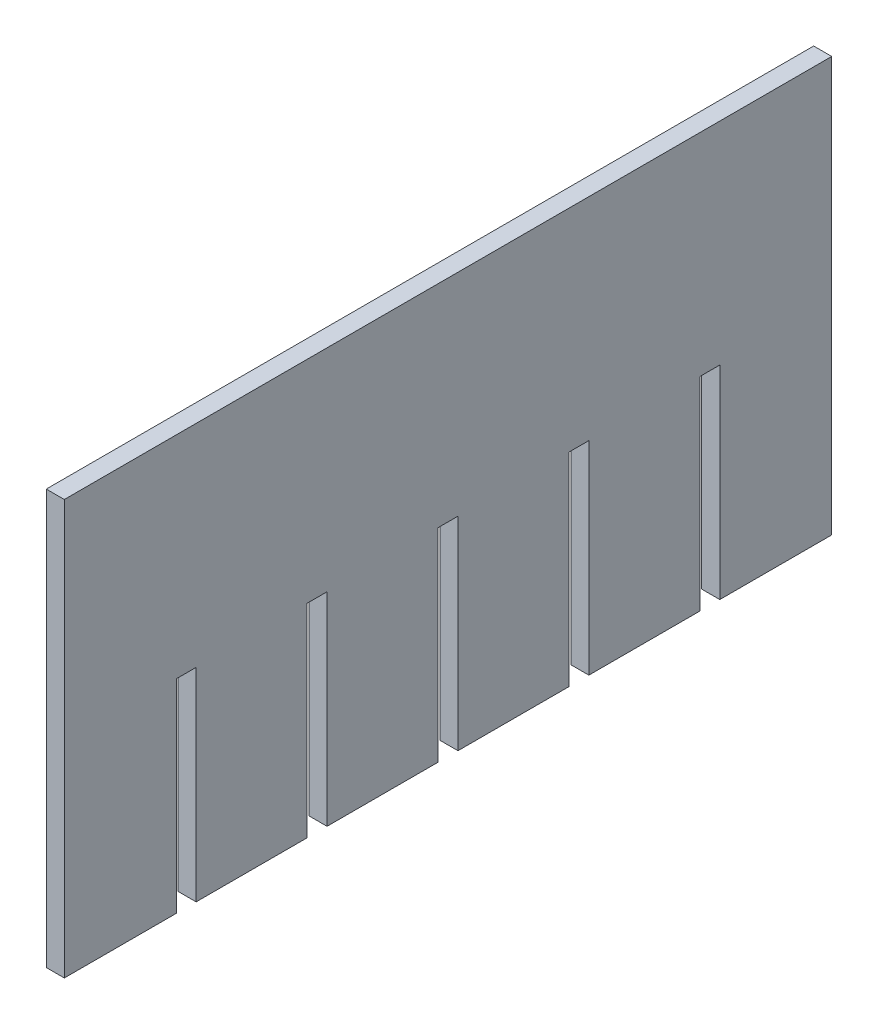
ISO-10303-21;
HEADER;
FILE_DESCRIPTION(('STEP AP214'),'2;1');
FILE_NAME('part.step','',(''),(''),'','','');
FILE_SCHEMA(('AUTOMOTIVE_DESIGN { 1 0 10303 214 1 1 1 1 }'));
ENDSEC;
DATA;
#1=APPLICATION_CONTEXT('core data for automotive mechanical design processes');
#2=APPLICATION_PROTOCOL_DEFINITION('international standard','automotive_design',2000,#1);
#3=PRODUCT_CONTEXT('',#1,'mechanical');
#4=PRODUCT('Part','Part','',(#3));
#5=PRODUCT_RELATED_PRODUCT_CATEGORY('part','',(#4));
#6=PRODUCT_DEFINITION_FORMATION('','',#4);
#7=PRODUCT_DEFINITION_CONTEXT('part definition',#1,'design');
#8=PRODUCT_DEFINITION('design','',#6,#7);
#9=PRODUCT_DEFINITION_SHAPE('','',#8);
#10=(LENGTH_UNIT() NAMED_UNIT(*) SI_UNIT(.MILLI.,.METRE.));
#11=(NAMED_UNIT(*) PLANE_ANGLE_UNIT() SI_UNIT($,.RADIAN.));
#12=(NAMED_UNIT(*) SI_UNIT($,.STERADIAN.) SOLID_ANGLE_UNIT());
#13=UNCERTAINTY_MEASURE_WITH_UNIT(LENGTH_MEASURE(1.E-05),#10,'distance_accuracy_value','');
#14=(GEOMETRIC_REPRESENTATION_CONTEXT(3) GLOBAL_UNCERTAINTY_ASSIGNED_CONTEXT((#13)) GLOBAL_UNIT_ASSIGNED_CONTEXT((#10,
#11,#12)) REPRESENTATION_CONTEXT('',''));
#15=CARTESIAN_POINT('',(0.,0.,0.));
#16=DIRECTION('',(0.,0.,1.));
#17=DIRECTION('',(1.,0.,0.));
#18=AXIS2_PLACEMENT_3D('',#15,#16,#17);
#19=CARTESIAN_POINT('',(4.,0.,0.));
#20=DIRECTION('',(0.,1.,0.));
#21=DIRECTION('',(0.,0.,1.));
#22=AXIS2_PLACEMENT_3D('',#19,#20,#21);
#23=PLANE('',#22);
#24=DIRECTION('',(0.,0.,-1.));
#25=VECTOR('',#24,1.);
#26=CARTESIAN_POINT('',(0.,0.,0.));
#27=LINE('',#26,#25);
#28=CARTESIAN_POINT('',(0.,0.,0.));
#29=VERTEX_POINT('',#28);
#30=CARTESIAN_POINT('',(0.,0.,-24.8));
#31=VERTEX_POINT('',#30);
#32=EDGE_CURVE('E229',#29,#31,#27,.T.);
#33=ORIENTED_EDGE('',*,*,#32,.T.);
#34=DIRECTION('',(-1.,0.,0.));
#35=VECTOR('',#34,1.);
#36=CARTESIAN_POINT('',(4.,0.,-24.8));
#37=LINE('',#36,#35);
#38=CARTESIAN_POINT('',(4.,0.,-24.8));
#39=VERTEX_POINT('',#38);
#40=EDGE_CURVE('E11',#39,#31,#37,.T.);
#41=ORIENTED_EDGE('',*,*,#40,.F.);
#42=DIRECTION('',(0.,0.,-1.));
#43=VECTOR('',#42,1.);
#44=CARTESIAN_POINT('',(4.,0.,0.));
#45=LINE('',#44,#43);
#46=CARTESIAN_POINT('',(4.,0.,0.));
#47=VERTEX_POINT('',#46);
#48=EDGE_CURVE('E275',#47,#39,#45,.T.);
#49=ORIENTED_EDGE('',*,*,#48,.F.);
#50=DIRECTION('',(-1.,0.,0.));
#51=VECTOR('',#50,1.);
#52=CARTESIAN_POINT('',(4.,0.,0.));
#53=LINE('',#52,#51);
#54=EDGE_CURVE('E225',#47,#29,#53,.T.);
#55=ORIENTED_EDGE('',*,*,#54,.T.);
#56=EDGE_LOOP('',(#33,#41,#49,#55));
#57=FACE_BOUND('',#56,.T.);
#58=ADVANCED_FACE('F37',(#57),#23,.F.);
#59=CARTESIAN_POINT('',(4.,0.,-24.8));
#60=DIRECTION('',(0.,0.,1.));
#61=DIRECTION('',(1.,0.,0.));
#62=AXIS2_PLACEMENT_3D('',#59,#60,#61);
#63=PLANE('',#62);
#64=DIRECTION('',(0.,1.,0.));
#65=VECTOR('',#64,1.);
#66=CARTESIAN_POINT('',(0.,0.,-24.8));
#67=LINE('',#66,#65);
#68=CARTESIAN_POINT('',(0.,45.,-24.8));
#69=VERTEX_POINT('',#68);
#70=EDGE_CURVE('E232',#31,#69,#67,.T.);
#71=ORIENTED_EDGE('',*,*,#70,.T.);
#72=DIRECTION('',(-1.,0.,0.));
#73=VECTOR('',#72,1.);
#74=CARTESIAN_POINT('',(4.,45.,-24.8));
#75=LINE('',#74,#73);
#76=CARTESIAN_POINT('',(4.,45.,-24.8));
#77=VERTEX_POINT('',#76);
#78=EDGE_CURVE('E45',#77,#69,#75,.T.);
#79=ORIENTED_EDGE('',*,*,#78,.F.);
#80=DIRECTION('',(0.,1.,0.));
#81=VECTOR('',#80,1.);
#82=CARTESIAN_POINT('',(4.,0.,-24.8));
#83=LINE('',#82,#81);
#84=EDGE_CURVE('E144',#39,#77,#83,.T.);
#85=ORIENTED_EDGE('',*,*,#84,.F.);
#86=ORIENTED_EDGE('',*,*,#40,.T.);
#87=EDGE_LOOP('',(#71,#79,#85,#86));
#88=FACE_BOUND('',#87,.T.);
#89=ADVANCED_FACE('F413',(#88),#63,.F.);
#90=CARTESIAN_POINT('',(4.,45.,-24.8));
#91=DIRECTION('',(0.,1.,0.));
#92=DIRECTION('',(0.,0.,1.));
#93=AXIS2_PLACEMENT_3D('',#90,#91,#92);
#94=PLANE('',#93);
#95=DIRECTION('',(0.,0.,-1.));
#96=VECTOR('',#95,1.);
#97=CARTESIAN_POINT('',(0.,45.,-24.8));
#98=LINE('',#97,#96);
#99=CARTESIAN_POINT('',(0.,45.,-29.2));
#100=VERTEX_POINT('',#99);
#101=EDGE_CURVE('E234',#69,#100,#98,.T.);
#102=ORIENTED_EDGE('',*,*,#101,.T.);
#103=DIRECTION('',(-1.,0.,0.));
#104=VECTOR('',#103,1.);
#105=CARTESIAN_POINT('',(4.,45.,-29.2));
#106=LINE('',#105,#104);
#107=CARTESIAN_POINT('',(4.,45.,-29.2));
#108=VERTEX_POINT('',#107);
#109=EDGE_CURVE('E330',#108,#100,#106,.T.);
#110=ORIENTED_EDGE('',*,*,#109,.F.);
#111=DIRECTION('',(0.,0.,-1.));
#112=VECTOR('',#111,1.);
#113=CARTESIAN_POINT('',(4.,45.,-24.8));
#114=LINE('',#113,#112);
#115=EDGE_CURVE('E338',#77,#108,#114,.T.);
#116=ORIENTED_EDGE('',*,*,#115,.F.);
#117=ORIENTED_EDGE('',*,*,#78,.T.);
#118=EDGE_LOOP('',(#102,#110,#116,#117));
#119=FACE_BOUND('',#118,.T.);
#120=ADVANCED_FACE('F336',(#119),#94,.F.);
#121=CARTESIAN_POINT('',(4.,45.,-29.2));
#122=DIRECTION('',(0.,0.,-1.));
#123=DIRECTION('',(0.,1.,0.));
#124=AXIS2_PLACEMENT_3D('',#121,#122,#123);
#125=PLANE('',#124);
#126=DIRECTION('',(0.,-1.,0.));
#127=VECTOR('',#126,1.);
#128=CARTESIAN_POINT('',(0.,45.,-29.2));
#129=LINE('',#128,#127);
#130=CARTESIAN_POINT('',(0.,0.,-29.2));
#131=VERTEX_POINT('',#130);
#132=EDGE_CURVE('E236',#100,#131,#129,.T.);
#133=ORIENTED_EDGE('',*,*,#132,.T.);
#134=DIRECTION('',(-1.,0.,0.));
#135=VECTOR('',#134,1.);
#136=CARTESIAN_POINT('',(4.,0.,-29.2));
#137=LINE('',#136,#135);
#138=CARTESIAN_POINT('',(4.,0.,-29.2));
#139=VERTEX_POINT('',#138);
#140=EDGE_CURVE('E327',#139,#131,#137,.T.);
#141=ORIENTED_EDGE('',*,*,#140,.F.);
#142=DIRECTION('',(0.,-1.,0.));
#143=VECTOR('',#142,1.);
#144=CARTESIAN_POINT('',(4.,45.,-29.2));
#145=LINE('',#144,#143);
#146=EDGE_CURVE('E356',#108,#139,#145,.T.);
#147=ORIENTED_EDGE('',*,*,#146,.F.);
#148=ORIENTED_EDGE('',*,*,#109,.T.);
#149=EDGE_LOOP('',(#133,#141,#147,#148));
#150=FACE_BOUND('',#149,.T.);
#151=ADVANCED_FACE('F347',(#150),#125,.F.);
#152=CARTESIAN_POINT('',(4.,0.,-29.2));
#153=DIRECTION('',(0.,1.,0.));
#154=DIRECTION('',(0.,0.,1.));
#155=AXIS2_PLACEMENT_3D('',#152,#153,#154);
#156=PLANE('',#155);
#157=DIRECTION('',(0.,0.,-1.));
#158=VECTOR('',#157,1.);
#159=CARTESIAN_POINT('',(0.,0.,-29.2));
#160=LINE('',#159,#158);
#161=CARTESIAN_POINT('',(0.,0.,-53.8));
#162=VERTEX_POINT('',#161);
#163=EDGE_CURVE('E238',#131,#162,#160,.T.);
#164=ORIENTED_EDGE('',*,*,#163,.T.);
#165=DIRECTION('',(-1.,0.,0.));
#166=VECTOR('',#165,1.);
#167=CARTESIAN_POINT('',(4.,0.,-53.8));
#168=LINE('',#167,#166);
#169=CARTESIAN_POINT('',(4.,0.,-53.8));
#170=VERTEX_POINT('',#169);
#171=EDGE_CURVE('E324',#170,#162,#168,.T.);
#172=ORIENTED_EDGE('',*,*,#171,.F.);
#173=DIRECTION('',(0.,0.,-1.));
#174=VECTOR('',#173,1.);
#175=CARTESIAN_POINT('',(4.,0.,-29.2));
#176=LINE('',#175,#174);
#177=EDGE_CURVE('E353',#139,#170,#176,.T.);
#178=ORIENTED_EDGE('',*,*,#177,.F.);
#179=ORIENTED_EDGE('',*,*,#140,.T.);
#180=EDGE_LOOP('',(#164,#172,#178,#179));
#181=FACE_BOUND('',#180,.T.);
#182=ADVANCED_FACE('F351',(#181),#156,.F.);
#183=CARTESIAN_POINT('',(4.,0.,-53.8));
#184=DIRECTION('',(0.,0.,1.));
#185=DIRECTION('',(1.,0.,0.));
#186=AXIS2_PLACEMENT_3D('',#183,#184,#185);
#187=PLANE('',#186);
#188=DIRECTION('',(0.,1.,0.));
#189=VECTOR('',#188,1.);
#190=CARTESIAN_POINT('',(0.,0.,-53.8));
#191=LINE('',#190,#189);
#192=CARTESIAN_POINT('',(0.,45.,-53.8));
#193=VERTEX_POINT('',#192);
#194=EDGE_CURVE('E240',#162,#193,#191,.T.);
#195=ORIENTED_EDGE('',*,*,#194,.T.);
#196=DIRECTION('',(-1.,0.,0.));
#197=VECTOR('',#196,1.);
#198=CARTESIAN_POINT('',(4.,45.,-53.8));
#199=LINE('',#198,#197);
#200=CARTESIAN_POINT('',(4.,45.,-53.8));
#201=VERTEX_POINT('',#200);
#202=EDGE_CURVE('E321',#201,#193,#199,.T.);
#203=ORIENTED_EDGE('',*,*,#202,.F.);
#204=DIRECTION('',(0.,1.,0.));
#205=VECTOR('',#204,1.);
#206=CARTESIAN_POINT('',(4.,0.,-53.8));
#207=LINE('',#206,#205);
#208=EDGE_CURVE('E355',#170,#201,#207,.T.);
#209=ORIENTED_EDGE('',*,*,#208,.F.);
#210=ORIENTED_EDGE('',*,*,#171,.T.);
#211=EDGE_LOOP('',(#195,#203,#209,#210));
#212=FACE_BOUND('',#211,.T.);
#213=ADVANCED_FACE('F426',(#212),#187,.F.);
#214=CARTESIAN_POINT('',(4.,45.,-53.8));
#215=DIRECTION('',(0.,1.,0.));
#216=DIRECTION('',(0.,0.,1.));
#217=AXIS2_PLACEMENT_3D('',#214,#215,#216);
#218=PLANE('',#217);
#219=DIRECTION('',(0.,0.,-1.));
#220=VECTOR('',#219,1.);
#221=CARTESIAN_POINT('',(0.,45.,-53.8));
#222=LINE('',#221,#220);
#223=CARTESIAN_POINT('',(0.,45.,-58.2));
#224=VERTEX_POINT('',#223);
#225=EDGE_CURVE('E242',#193,#224,#222,.T.);
#226=ORIENTED_EDGE('',*,*,#225,.T.);
#227=DIRECTION('',(-1.,0.,0.));
#228=VECTOR('',#227,1.);
#229=CARTESIAN_POINT('',(4.,45.,-58.2));
#230=LINE('',#229,#228);
#231=CARTESIAN_POINT('',(4.,45.,-58.2));
#232=VERTEX_POINT('',#231);
#233=EDGE_CURVE('E318',#232,#224,#230,.T.);
#234=ORIENTED_EDGE('',*,*,#233,.F.);
#235=DIRECTION('',(0.,0.,-1.));
#236=VECTOR('',#235,1.);
#237=CARTESIAN_POINT('',(4.,45.,-53.8));
#238=LINE('',#237,#236);
#239=EDGE_CURVE('E358',#201,#232,#238,.T.);
#240=ORIENTED_EDGE('',*,*,#239,.F.);
#241=ORIENTED_EDGE('',*,*,#202,.T.);
#242=EDGE_LOOP('',(#226,#234,#240,#241));
#243=FACE_BOUND('',#242,.T.);
#244=ADVANCED_FACE('F429',(#243),#218,.F.);
#245=CARTESIAN_POINT('',(4.,45.,-58.2));
#246=DIRECTION('',(0.,0.,-1.));
#247=DIRECTION('',(0.,1.,0.));
#248=AXIS2_PLACEMENT_3D('',#245,#246,#247);
#249=PLANE('',#248);
#250=DIRECTION('',(0.,-1.,0.));
#251=VECTOR('',#250,1.);
#252=CARTESIAN_POINT('',(0.,45.,-58.2));
#253=LINE('',#252,#251);
#254=CARTESIAN_POINT('',(0.,0.,-58.2));
#255=VERTEX_POINT('',#254);
#256=EDGE_CURVE('E244',#224,#255,#253,.T.);
#257=ORIENTED_EDGE('',*,*,#256,.T.);
#258=DIRECTION('',(-1.,0.,0.));
#259=VECTOR('',#258,1.);
#260=CARTESIAN_POINT('',(4.,0.,-58.2));
#261=LINE('',#260,#259);
#262=CARTESIAN_POINT('',(4.,0.,-58.2));
#263=VERTEX_POINT('',#262);
#264=EDGE_CURVE('E315',#263,#255,#261,.T.);
#265=ORIENTED_EDGE('',*,*,#264,.F.);
#266=DIRECTION('',(0.,-1.,0.));
#267=VECTOR('',#266,1.);
#268=CARTESIAN_POINT('',(4.,45.,-58.2));
#269=LINE('',#268,#267);
#270=EDGE_CURVE('E364',#232,#263,#269,.T.);
#271=ORIENTED_EDGE('',*,*,#270,.F.);
#272=ORIENTED_EDGE('',*,*,#233,.T.);
#273=EDGE_LOOP('',(#257,#265,#271,#272));
#274=FACE_BOUND('',#273,.T.);
#275=ADVANCED_FACE('F433',(#274),#249,.F.);
#276=CARTESIAN_POINT('',(4.,0.,-58.2));
#277=DIRECTION('',(0.,1.,0.));
#278=DIRECTION('',(0.,0.,1.));
#279=AXIS2_PLACEMENT_3D('',#276,#277,#278);
#280=PLANE('',#279);
#281=DIRECTION('',(0.,0.,-1.));
#282=VECTOR('',#281,1.);
#283=CARTESIAN_POINT('',(0.,0.,-58.2));
#284=LINE('',#283,#282);
#285=CARTESIAN_POINT('',(0.,0.,-82.8));
#286=VERTEX_POINT('',#285);
#287=EDGE_CURVE('E246',#255,#286,#284,.T.);
#288=ORIENTED_EDGE('',*,*,#287,.T.);
#289=DIRECTION('',(-1.,0.,0.));
#290=VECTOR('',#289,1.);
#291=CARTESIAN_POINT('',(4.,0.,-82.8));
#292=LINE('',#291,#290);
#293=CARTESIAN_POINT('',(4.,0.,-82.8));
#294=VERTEX_POINT('',#293);
#295=EDGE_CURVE('E312',#294,#286,#292,.T.);
#296=ORIENTED_EDGE('',*,*,#295,.F.);
#297=DIRECTION('',(0.,0.,-1.));
#298=VECTOR('',#297,1.);
#299=CARTESIAN_POINT('',(4.,0.,-58.2));
#300=LINE('',#299,#298);
#301=EDGE_CURVE('E366',#263,#294,#300,.T.);
#302=ORIENTED_EDGE('',*,*,#301,.F.);
#303=ORIENTED_EDGE('',*,*,#264,.T.);
#304=EDGE_LOOP('',(#288,#296,#302,#303));
#305=FACE_BOUND('',#304,.T.);
#306=ADVANCED_FACE('F437',(#305),#280,.F.);
#307=CARTESIAN_POINT('',(4.,0.,-82.8));
#308=DIRECTION('',(0.,0.,1.));
#309=DIRECTION('',(1.,0.,0.));
#310=AXIS2_PLACEMENT_3D('',#307,#308,#309);
#311=PLANE('',#310);
#312=DIRECTION('',(0.,1.,0.));
#313=VECTOR('',#312,1.);
#314=CARTESIAN_POINT('',(0.,0.,-82.8));
#315=LINE('',#314,#313);
#316=CARTESIAN_POINT('',(0.,45.,-82.8));
#317=VERTEX_POINT('',#316);
#318=EDGE_CURVE('E248',#286,#317,#315,.T.);
#319=ORIENTED_EDGE('',*,*,#318,.T.);
#320=DIRECTION('',(-1.,0.,0.));
#321=VECTOR('',#320,1.);
#322=CARTESIAN_POINT('',(4.,45.,-82.8));
#323=LINE('',#322,#321);
#324=CARTESIAN_POINT('',(4.,45.,-82.8));
#325=VERTEX_POINT('',#324);
#326=EDGE_CURVE('E309',#325,#317,#323,.T.);
#327=ORIENTED_EDGE('',*,*,#326,.F.);
#328=DIRECTION('',(0.,1.,0.));
#329=VECTOR('',#328,1.);
#330=CARTESIAN_POINT('',(4.,0.,-82.8));
#331=LINE('',#330,#329);
#332=EDGE_CURVE('E368',#294,#325,#331,.T.);
#333=ORIENTED_EDGE('',*,*,#332,.F.);
#334=ORIENTED_EDGE('',*,*,#295,.T.);
#335=EDGE_LOOP('',(#319,#327,#333,#334));
#336=FACE_BOUND('',#335,.T.);
#337=ADVANCED_FACE('F441',(#336),#311,.F.);
#338=CARTESIAN_POINT('',(4.,45.,-82.8));
#339=DIRECTION('',(0.,1.,0.));
#340=DIRECTION('',(0.,0.,1.));
#341=AXIS2_PLACEMENT_3D('',#338,#339,#340);
#342=PLANE('',#341);
#343=DIRECTION('',(0.,0.,-1.));
#344=VECTOR('',#343,1.);
#345=CARTESIAN_POINT('',(0.,45.,-82.8));
#346=LINE('',#345,#344);
#347=CARTESIAN_POINT('',(0.,45.,-87.2));
#348=VERTEX_POINT('',#347);
#349=EDGE_CURVE('E250',#317,#348,#346,.T.);
#350=ORIENTED_EDGE('',*,*,#349,.T.);
#351=DIRECTION('',(-1.,0.,0.));
#352=VECTOR('',#351,1.);
#353=CARTESIAN_POINT('',(4.,45.,-87.2));
#354=LINE('',#353,#352);
#355=CARTESIAN_POINT('',(4.,45.,-87.2));
#356=VERTEX_POINT('',#355);
#357=EDGE_CURVE('E306',#356,#348,#354,.T.);
#358=ORIENTED_EDGE('',*,*,#357,.F.);
#359=DIRECTION('',(0.,0.,-1.));
#360=VECTOR('',#359,1.);
#361=CARTESIAN_POINT('',(4.,45.,-82.8));
#362=LINE('',#361,#360);
#363=EDGE_CURVE('E370',#325,#356,#362,.T.);
#364=ORIENTED_EDGE('',*,*,#363,.F.);
#365=ORIENTED_EDGE('',*,*,#326,.T.);
#366=EDGE_LOOP('',(#350,#358,#364,#365));
#367=FACE_BOUND('',#366,.T.);
#368=ADVANCED_FACE('F445',(#367),#342,.F.);
#369=CARTESIAN_POINT('',(4.,45.,-87.2));
#370=DIRECTION('',(0.,0.,-1.));
#371=DIRECTION('',(0.,1.,0.));
#372=AXIS2_PLACEMENT_3D('',#369,#370,#371);
#373=PLANE('',#372);
#374=DIRECTION('',(0.,-1.,0.));
#375=VECTOR('',#374,1.);
#376=CARTESIAN_POINT('',(0.,45.,-87.2));
#377=LINE('',#376,#375);
#378=CARTESIAN_POINT('',(0.,0.,-87.2));
#379=VERTEX_POINT('',#378);
#380=EDGE_CURVE('E252',#348,#379,#377,.T.);
#381=ORIENTED_EDGE('',*,*,#380,.T.);
#382=DIRECTION('',(-1.,0.,0.));
#383=VECTOR('',#382,1.);
#384=CARTESIAN_POINT('',(4.,0.,-87.2));
#385=LINE('',#384,#383);
#386=CARTESIAN_POINT('',(4.,0.,-87.2));
#387=VERTEX_POINT('',#386);
#388=EDGE_CURVE('E303',#387,#379,#385,.T.);
#389=ORIENTED_EDGE('',*,*,#388,.F.);
#390=DIRECTION('',(0.,-1.,0.));
#391=VECTOR('',#390,1.);
#392=CARTESIAN_POINT('',(4.,45.,-87.2));
#393=LINE('',#392,#391);
#394=EDGE_CURVE('E372',#356,#387,#393,.T.);
#395=ORIENTED_EDGE('',*,*,#394,.F.);
#396=ORIENTED_EDGE('',*,*,#357,.T.);
#397=EDGE_LOOP('',(#381,#389,#395,#396));
#398=FACE_BOUND('',#397,.T.);
#399=ADVANCED_FACE('F449',(#398),#373,.F.);
#400=CARTESIAN_POINT('',(4.,0.,-87.2));
#401=DIRECTION('',(0.,1.,0.));
#402=DIRECTION('',(0.,0.,1.));
#403=AXIS2_PLACEMENT_3D('',#400,#401,#402);
#404=PLANE('',#403);
#405=DIRECTION('',(0.,0.,-1.));
#406=VECTOR('',#405,1.);
#407=CARTESIAN_POINT('',(0.,0.,-87.2));
#408=LINE('',#407,#406);
#409=CARTESIAN_POINT('',(0.,0.,-111.8));
#410=VERTEX_POINT('',#409);
#411=EDGE_CURVE('E254',#379,#410,#408,.T.);
#412=ORIENTED_EDGE('',*,*,#411,.T.);
#413=DIRECTION('',(-1.,0.,0.));
#414=VECTOR('',#413,1.);
#415=CARTESIAN_POINT('',(4.,0.,-111.8));
#416=LINE('',#415,#414);
#417=CARTESIAN_POINT('',(4.,0.,-111.8));
#418=VERTEX_POINT('',#417);
#419=EDGE_CURVE('E300',#418,#410,#416,.T.);
#420=ORIENTED_EDGE('',*,*,#419,.F.);
#421=DIRECTION('',(0.,0.,-1.));
#422=VECTOR('',#421,1.);
#423=CARTESIAN_POINT('',(4.,0.,-87.2));
#424=LINE('',#423,#422);
#425=EDGE_CURVE('E374',#387,#418,#424,.T.);
#426=ORIENTED_EDGE('',*,*,#425,.F.);
#427=ORIENTED_EDGE('',*,*,#388,.T.);
#428=EDGE_LOOP('',(#412,#420,#426,#427));
#429=FACE_BOUND('',#428,.T.);
#430=ADVANCED_FACE('F453',(#429),#404,.F.);
#431=CARTESIAN_POINT('',(4.,0.,-111.8));
#432=DIRECTION('',(0.,0.,1.));
#433=DIRECTION('',(1.,0.,0.));
#434=AXIS2_PLACEMENT_3D('',#431,#432,#433);
#435=PLANE('',#434);
#436=DIRECTION('',(0.,1.,0.));
#437=VECTOR('',#436,1.);
#438=CARTESIAN_POINT('',(0.,0.,-111.8));
#439=LINE('',#438,#437);
#440=CARTESIAN_POINT('',(0.,45.,-111.8));
#441=VERTEX_POINT('',#440);
#442=EDGE_CURVE('E256',#410,#441,#439,.T.);
#443=ORIENTED_EDGE('',*,*,#442,.T.);
#444=DIRECTION('',(-1.,0.,0.));
#445=VECTOR('',#444,1.);
#446=CARTESIAN_POINT('',(4.,45.,-111.8));
#447=LINE('',#446,#445);
#448=CARTESIAN_POINT('',(4.,45.,-111.8));
#449=VERTEX_POINT('',#448);
#450=EDGE_CURVE('E297',#449,#441,#447,.T.);
#451=ORIENTED_EDGE('',*,*,#450,.F.);
#452=DIRECTION('',(0.,1.,0.));
#453=VECTOR('',#452,1.);
#454=CARTESIAN_POINT('',(4.,0.,-111.8));
#455=LINE('',#454,#453);
#456=EDGE_CURVE('E376',#418,#449,#455,.T.);
#457=ORIENTED_EDGE('',*,*,#456,.F.);
#458=ORIENTED_EDGE('',*,*,#419,.T.);
#459=EDGE_LOOP('',(#443,#451,#457,#458));
#460=FACE_BOUND('',#459,.T.);
#461=ADVANCED_FACE('F457',(#460),#435,.F.);
#462=CARTESIAN_POINT('',(4.,45.,-111.8));
#463=DIRECTION('',(0.,1.,0.));
#464=DIRECTION('',(0.,0.,1.));
#465=AXIS2_PLACEMENT_3D('',#462,#463,#464);
#466=PLANE('',#465);
#467=DIRECTION('',(0.,0.,-1.));
#468=VECTOR('',#467,1.);
#469=CARTESIAN_POINT('',(0.,45.,-111.8));
#470=LINE('',#469,#468);
#471=CARTESIAN_POINT('',(0.,45.,-116.2));
#472=VERTEX_POINT('',#471);
#473=EDGE_CURVE('E258',#441,#472,#470,.T.);
#474=ORIENTED_EDGE('',*,*,#473,.T.);
#475=DIRECTION('',(-1.,0.,0.));
#476=VECTOR('',#475,1.);
#477=CARTESIAN_POINT('',(4.,45.,-116.2));
#478=LINE('',#477,#476);
#479=CARTESIAN_POINT('',(4.,45.,-116.2));
#480=VERTEX_POINT('',#479);
#481=EDGE_CURVE('E294',#480,#472,#478,.T.);
#482=ORIENTED_EDGE('',*,*,#481,.F.);
#483=DIRECTION('',(0.,0.,-1.));
#484=VECTOR('',#483,1.);
#485=CARTESIAN_POINT('',(4.,45.,-111.8));
#486=LINE('',#485,#484);
#487=EDGE_CURVE('E378',#449,#480,#486,.T.);
#488=ORIENTED_EDGE('',*,*,#487,.F.);
#489=ORIENTED_EDGE('',*,*,#450,.T.);
#490=EDGE_LOOP('',(#474,#482,#488,#489));
#491=FACE_BOUND('',#490,.T.);
#492=ADVANCED_FACE('F461',(#491),#466,.F.);
#493=CARTESIAN_POINT('',(4.,45.,-116.2));
#494=DIRECTION('',(0.,0.,-1.));
#495=DIRECTION('',(0.,1.,0.));
#496=AXIS2_PLACEMENT_3D('',#493,#494,#495);
#497=PLANE('',#496);
#498=DIRECTION('',(0.,-1.,0.));
#499=VECTOR('',#498,1.);
#500=CARTESIAN_POINT('',(0.,45.,-116.2));
#501=LINE('',#500,#499);
#502=CARTESIAN_POINT('',(0.,0.,-116.2));
#503=VERTEX_POINT('',#502);
#504=EDGE_CURVE('E260',#472,#503,#501,.T.);
#505=ORIENTED_EDGE('',*,*,#504,.T.);
#506=DIRECTION('',(-1.,0.,0.));
#507=VECTOR('',#506,1.);
#508=CARTESIAN_POINT('',(4.,0.,-116.2));
#509=LINE('',#508,#507);
#510=CARTESIAN_POINT('',(4.,0.,-116.2));
#511=VERTEX_POINT('',#510);
#512=EDGE_CURVE('E291',#511,#503,#509,.T.);
#513=ORIENTED_EDGE('',*,*,#512,.F.);
#514=DIRECTION('',(0.,-1.,0.));
#515=VECTOR('',#514,1.);
#516=CARTESIAN_POINT('',(4.,45.,-116.2));
#517=LINE('',#516,#515);
#518=EDGE_CURVE('E380',#480,#511,#517,.T.);
#519=ORIENTED_EDGE('',*,*,#518,.F.);
#520=ORIENTED_EDGE('',*,*,#481,.T.);
#521=EDGE_LOOP('',(#505,#513,#519,#520));
#522=FACE_BOUND('',#521,.T.);
#523=ADVANCED_FACE('F465',(#522),#497,.F.);
#524=CARTESIAN_POINT('',(4.,0.,-116.2));
#525=DIRECTION('',(0.,1.,0.));
#526=DIRECTION('',(0.,0.,1.));
#527=AXIS2_PLACEMENT_3D('',#524,#525,#526);
#528=PLANE('',#527);
#529=DIRECTION('',(0.,0.,-1.));
#530=VECTOR('',#529,1.);
#531=CARTESIAN_POINT('',(0.,0.,-116.2));
#532=LINE('',#531,#530);
#533=CARTESIAN_POINT('',(0.,0.,-140.8));
#534=VERTEX_POINT('',#533);
#535=EDGE_CURVE('E262',#503,#534,#532,.T.);
#536=ORIENTED_EDGE('',*,*,#535,.T.);
#537=DIRECTION('',(-1.,0.,0.));
#538=VECTOR('',#537,1.);
#539=CARTESIAN_POINT('',(4.,0.,-140.8));
#540=LINE('',#539,#538);
#541=CARTESIAN_POINT('',(4.,0.,-140.8));
#542=VERTEX_POINT('',#541);
#543=EDGE_CURVE('E288',#542,#534,#540,.T.);
#544=ORIENTED_EDGE('',*,*,#543,.F.);
#545=DIRECTION('',(0.,0.,-1.));
#546=VECTOR('',#545,1.);
#547=CARTESIAN_POINT('',(4.,0.,-116.2));
#548=LINE('',#547,#546);
#549=EDGE_CURVE('E382',#511,#542,#548,.T.);
#550=ORIENTED_EDGE('',*,*,#549,.F.);
#551=ORIENTED_EDGE('',*,*,#512,.T.);
#552=EDGE_LOOP('',(#536,#544,#550,#551));
#553=FACE_BOUND('',#552,.T.);
#554=ADVANCED_FACE('F469',(#553),#528,.F.);
#555=CARTESIAN_POINT('',(4.,0.,-140.8));
#556=DIRECTION('',(0.,0.,1.));
#557=DIRECTION('',(1.,0.,0.));
#558=AXIS2_PLACEMENT_3D('',#555,#556,#557);
#559=PLANE('',#558);
#560=DIRECTION('',(0.,1.,0.));
#561=VECTOR('',#560,1.);
#562=CARTESIAN_POINT('',(0.,0.,-140.8));
#563=LINE('',#562,#561);
#564=CARTESIAN_POINT('',(0.,45.,-140.8));
#565=VERTEX_POINT('',#564);
#566=EDGE_CURVE('E264',#534,#565,#563,.T.);
#567=ORIENTED_EDGE('',*,*,#566,.T.);
#568=DIRECTION('',(-1.,0.,0.));
#569=VECTOR('',#568,1.);
#570=CARTESIAN_POINT('',(4.,45.,-140.8));
#571=LINE('',#570,#569);
#572=CARTESIAN_POINT('',(4.,45.,-140.8));
#573=VERTEX_POINT('',#572);
#574=EDGE_CURVE('E285',#573,#565,#571,.T.);
#575=ORIENTED_EDGE('',*,*,#574,.F.);
#576=DIRECTION('',(0.,1.,0.));
#577=VECTOR('',#576,1.);
#578=CARTESIAN_POINT('',(4.,0.,-140.8));
#579=LINE('',#578,#577);
#580=EDGE_CURVE('E384',#542,#573,#579,.T.);
#581=ORIENTED_EDGE('',*,*,#580,.F.);
#582=ORIENTED_EDGE('',*,*,#543,.T.);
#583=EDGE_LOOP('',(#567,#575,#581,#582));
#584=FACE_BOUND('',#583,.T.);
#585=ADVANCED_FACE('F473',(#584),#559,.F.);
#586=CARTESIAN_POINT('',(4.,45.,-140.8));
#587=DIRECTION('',(0.,1.,0.));
#588=DIRECTION('',(0.,0.,1.));
#589=AXIS2_PLACEMENT_3D('',#586,#587,#588);
#590=PLANE('',#589);
#591=DIRECTION('',(0.,0.,-1.));
#592=VECTOR('',#591,1.);
#593=CARTESIAN_POINT('',(0.,45.,-140.8));
#594=LINE('',#593,#592);
#595=CARTESIAN_POINT('',(0.,45.,-145.2));
#596=VERTEX_POINT('',#595);
#597=EDGE_CURVE('E266',#565,#596,#594,.T.);
#598=ORIENTED_EDGE('',*,*,#597,.T.);
#599=DIRECTION('',(-1.,0.,0.));
#600=VECTOR('',#599,1.);
#601=CARTESIAN_POINT('',(4.,45.,-145.2));
#602=LINE('',#601,#600);
#603=CARTESIAN_POINT('',(4.,45.,-145.2));
#604=VERTEX_POINT('',#603);
#605=EDGE_CURVE('E282',#604,#596,#602,.T.);
#606=ORIENTED_EDGE('',*,*,#605,.F.);
#607=DIRECTION('',(0.,0.,-1.));
#608=VECTOR('',#607,1.);
#609=CARTESIAN_POINT('',(4.,45.,-140.8));
#610=LINE('',#609,#608);
#611=EDGE_CURVE('E386',#573,#604,#610,.T.);
#612=ORIENTED_EDGE('',*,*,#611,.F.);
#613=ORIENTED_EDGE('',*,*,#574,.T.);
#614=EDGE_LOOP('',(#598,#606,#612,#613));
#615=FACE_BOUND('',#614,.T.);
#616=ADVANCED_FACE('F477',(#615),#590,.F.);
#617=CARTESIAN_POINT('',(4.,45.,-145.2));
#618=DIRECTION('',(0.,0.,-1.));
#619=DIRECTION('',(-1.,0.,0.));
#620=AXIS2_PLACEMENT_3D('',#617,#618,#619);
#621=PLANE('',#620);
#622=DIRECTION('',(0.,-1.,0.));
#623=VECTOR('',#622,1.);
#624=CARTESIAN_POINT('',(0.,45.,-145.2));
#625=LINE('',#624,#623);
#626=CARTESIAN_POINT('',(0.,0.,-145.2));
#627=VERTEX_POINT('',#626);
#628=EDGE_CURVE('E268',#596,#627,#625,.T.);
#629=ORIENTED_EDGE('',*,*,#628,.T.);
#630=DIRECTION('',(-1.,0.,0.));
#631=VECTOR('',#630,1.);
#632=CARTESIAN_POINT('',(4.,0.,-145.2));
#633=LINE('',#632,#631);
#634=CARTESIAN_POINT('',(4.,0.,-145.2));
#635=VERTEX_POINT('',#634);
#636=EDGE_CURVE('E279',#635,#627,#633,.T.);
#637=ORIENTED_EDGE('',*,*,#636,.F.);
#638=DIRECTION('',(0.,-1.,0.));
#639=VECTOR('',#638,1.);
#640=CARTESIAN_POINT('',(4.,45.,-145.2));
#641=LINE('',#640,#639);
#642=EDGE_CURVE('E388',#604,#635,#641,.T.);
#643=ORIENTED_EDGE('',*,*,#642,.F.);
#644=ORIENTED_EDGE('',*,*,#605,.T.);
#645=EDGE_LOOP('',(#629,#637,#643,#644));
#646=FACE_BOUND('',#645,.T.);
#647=ADVANCED_FACE('F394',(#646),#621,.F.);
#648=CARTESIAN_POINT('',(4.,0.,-170.));
#649=DIRECTION('',(0.,1.,0.));
#650=DIRECTION('',(0.,0.,1.));
#651=AXIS2_PLACEMENT_3D('',#648,#649,#650);
#652=PLANE('',#651);
#653=DIRECTION('',(0.,0.,-1.));
#654=VECTOR('',#653,1.);
#655=CARTESIAN_POINT('',(0.,0.,-170.));
#656=LINE('',#655,#654);
#657=CARTESIAN_POINT('',(0.,0.,-170.));
#658=VERTEX_POINT('',#657);
#659=EDGE_CURVE('E270',#627,#658,#656,.T.);
#660=ORIENTED_EDGE('',*,*,#659,.T.);
#661=DIRECTION('',(-1.,0.,0.));
#662=VECTOR('',#661,1.);
#663=CARTESIAN_POINT('',(4.,0.,-170.));
#664=LINE('',#663,#662);
#665=CARTESIAN_POINT('',(4.,0.,-170.));
#666=VERTEX_POINT('',#665);
#667=EDGE_CURVE('E220',#666,#658,#664,.T.);
#668=ORIENTED_EDGE('',*,*,#667,.F.);
#669=DIRECTION('',(0.,0.,-1.));
#670=VECTOR('',#669,1.);
#671=CARTESIAN_POINT('',(4.,0.,-170.));
#672=LINE('',#671,#670);
#673=EDGE_CURVE('E211',#635,#666,#672,.T.);
#674=ORIENTED_EDGE('',*,*,#673,.F.);
#675=ORIENTED_EDGE('',*,*,#636,.T.);
#676=EDGE_LOOP('',(#660,#668,#674,#675));
#677=FACE_BOUND('',#676,.T.);
#678=ADVANCED_FACE('F398',(#677),#652,.F.);
#679=CARTESIAN_POINT('',(4.,91.8,-170.));
#680=DIRECTION('',(0.,0.,1.));
#681=DIRECTION('',(1.,0.,0.));
#682=AXIS2_PLACEMENT_3D('',#679,#680,#681);
#683=PLANE('',#682);
#684=DIRECTION('',(0.,1.,0.));
#685=VECTOR('',#684,1.);
#686=CARTESIAN_POINT('',(0.,91.8,-170.));
#687=LINE('',#686,#685);
#688=CARTESIAN_POINT('',(0.,91.8,-170.));
#689=VERTEX_POINT('',#688);
#690=EDGE_CURVE('E219',#658,#689,#687,.T.);
#691=ORIENTED_EDGE('',*,*,#690,.T.);
#692=DIRECTION('',(-1.,0.,0.));
#693=VECTOR('',#692,1.);
#694=CARTESIAN_POINT('',(4.,91.8,-170.));
#695=LINE('',#694,#693);
#696=CARTESIAN_POINT('',(4.,91.8,-170.));
#697=VERTEX_POINT('',#696);
#698=EDGE_CURVE('E216',#697,#689,#695,.T.);
#699=ORIENTED_EDGE('',*,*,#698,.F.);
#700=DIRECTION('',(0.,1.,0.));
#701=VECTOR('',#700,1.);
#702=CARTESIAN_POINT('',(4.,91.8,-170.));
#703=LINE('',#702,#701);
#704=EDGE_CURVE('E205',#666,#697,#703,.T.);
#705=ORIENTED_EDGE('',*,*,#704,.F.);
#706=ORIENTED_EDGE('',*,*,#667,.T.);
#707=EDGE_LOOP('',(#691,#699,#705,#706));
#708=FACE_BOUND('',#707,.T.);
#709=ADVANCED_FACE('F217',(#708),#683,.F.);
#710=CARTESIAN_POINT('',(4.,91.8,0.));
#711=DIRECTION('',(0.,-1.,0.));
#712=DIRECTION('',(0.,0.,-1.));
#713=AXIS2_PLACEMENT_3D('',#710,#711,#712);
#714=PLANE('',#713);
#715=DIRECTION('',(0.,0.,1.));
#716=VECTOR('',#715,1.);
#717=CARTESIAN_POINT('',(0.,91.8,0.));
#718=LINE('',#717,#716);
#719=CARTESIAN_POINT('',(0.,91.8,0.));
#720=VERTEX_POINT('',#719);
#721=EDGE_CURVE('E130',#689,#720,#718,.T.);
#722=ORIENTED_EDGE('',*,*,#721,.T.);
#723=DIRECTION('',(-1.,0.,0.));
#724=VECTOR('',#723,1.);
#725=CARTESIAN_POINT('',(4.,91.8,0.));
#726=LINE('',#725,#724);
#727=CARTESIAN_POINT('',(4.,91.8,0.));
#728=VERTEX_POINT('',#727);
#729=EDGE_CURVE('E221',#728,#720,#726,.T.);
#730=ORIENTED_EDGE('',*,*,#729,.F.);
#731=DIRECTION('',(0.,0.,1.));
#732=VECTOR('',#731,1.);
#733=CARTESIAN_POINT('',(4.,91.8,0.));
#734=LINE('',#733,#732);
#735=EDGE_CURVE('E209',#697,#728,#734,.T.);
#736=ORIENTED_EDGE('',*,*,#735,.F.);
#737=ORIENTED_EDGE('',*,*,#698,.T.);
#738=EDGE_LOOP('',(#722,#730,#736,#737));
#739=FACE_BOUND('',#738,.T.);
#740=ADVANCED_FACE('F223',(#739),#714,.F.);
#741=CARTESIAN_POINT('',(4.,0.,0.));
#742=DIRECTION('',(0.,0.,-1.));
#743=DIRECTION('',(-1.,0.,0.));
#744=AXIS2_PLACEMENT_3D('',#741,#742,#743);
#745=PLANE('',#744);
#746=DIRECTION('',(0.,-1.,0.));
#747=VECTOR('',#746,1.);
#748=CARTESIAN_POINT('',(0.,0.,0.));
#749=LINE('',#748,#747);
#750=EDGE_CURVE('E136',#720,#29,#749,.T.);
#751=ORIENTED_EDGE('',*,*,#750,.T.);
#752=ORIENTED_EDGE('',*,*,#54,.F.);
#753=DIRECTION('',(0.,-1.,0.));
#754=VECTOR('',#753,1.);
#755=CARTESIAN_POINT('',(4.,0.,0.));
#756=LINE('',#755,#754);
#757=EDGE_CURVE('E53',#728,#47,#756,.T.);
#758=ORIENTED_EDGE('',*,*,#757,.F.);
#759=ORIENTED_EDGE('',*,*,#729,.T.);
#760=EDGE_LOOP('',(#751,#752,#758,#759));
#761=FACE_BOUND('',#760,.T.);
#762=ADVANCED_FACE('F402',(#761),#745,.F.);
#763=CARTESIAN_POINT('',(4.,0.,0.));
#764=DIRECTION('',(1.,0.,0.));
#765=DIRECTION('',(0.,0.,-1.));
#766=AXIS2_PLACEMENT_3D('',#763,#764,#765);
#767=PLANE('',#766);
#768=ORIENTED_EDGE('',*,*,#48,.T.);
#769=ORIENTED_EDGE('',*,*,#84,.T.);
#770=ORIENTED_EDGE('',*,*,#115,.T.);
#771=ORIENTED_EDGE('',*,*,#146,.T.);
#772=ORIENTED_EDGE('',*,*,#177,.T.);
#773=ORIENTED_EDGE('',*,*,#208,.T.);
#774=ORIENTED_EDGE('',*,*,#239,.T.);
#775=ORIENTED_EDGE('',*,*,#270,.T.);
#776=ORIENTED_EDGE('',*,*,#301,.T.);
#777=ORIENTED_EDGE('',*,*,#332,.T.);
#778=ORIENTED_EDGE('',*,*,#363,.T.);
#779=ORIENTED_EDGE('',*,*,#394,.T.);
#780=ORIENTED_EDGE('',*,*,#425,.T.);
#781=ORIENTED_EDGE('',*,*,#456,.T.);
#782=ORIENTED_EDGE('',*,*,#487,.T.);
#783=ORIENTED_EDGE('',*,*,#518,.T.);
#784=ORIENTED_EDGE('',*,*,#549,.T.);
#785=ORIENTED_EDGE('',*,*,#580,.T.);
#786=ORIENTED_EDGE('',*,*,#611,.T.);
#787=ORIENTED_EDGE('',*,*,#642,.T.);
#788=ORIENTED_EDGE('',*,*,#673,.T.);
#789=ORIENTED_EDGE('',*,*,#704,.T.);
#790=ORIENTED_EDGE('',*,*,#735,.T.);
#791=ORIENTED_EDGE('',*,*,#757,.T.);
#792=EDGE_LOOP('',(#768,#769,#770,#771,#772,#773,#774,#775,#776,#777,#778,#779,#780,#781,#782,
#783,#784,#785,#786,#787,#788,#789,#790,#791));
#793=FACE_BOUND('',#792,.T.);
#794=ADVANCED_FACE('F207',(#793),#767,.T.);
#795=CARTESIAN_POINT('',(0.,0.,0.));
#796=DIRECTION('',(1.,0.,0.));
#797=DIRECTION('',(0.,0.,-1.));
#798=AXIS2_PLACEMENT_3D('',#795,#796,#797);
#799=PLANE('',#798);
#800=ORIENTED_EDGE('',*,*,#32,.F.);
#801=ORIENTED_EDGE('',*,*,#750,.F.);
#802=ORIENTED_EDGE('',*,*,#721,.F.);
#803=ORIENTED_EDGE('',*,*,#690,.F.);
#804=ORIENTED_EDGE('',*,*,#659,.F.);
#805=ORIENTED_EDGE('',*,*,#628,.F.);
#806=ORIENTED_EDGE('',*,*,#597,.F.);
#807=ORIENTED_EDGE('',*,*,#566,.F.);
#808=ORIENTED_EDGE('',*,*,#535,.F.);
#809=ORIENTED_EDGE('',*,*,#504,.F.);
#810=ORIENTED_EDGE('',*,*,#473,.F.);
#811=ORIENTED_EDGE('',*,*,#442,.F.);
#812=ORIENTED_EDGE('',*,*,#411,.F.);
#813=ORIENTED_EDGE('',*,*,#380,.F.);
#814=ORIENTED_EDGE('',*,*,#349,.F.);
#815=ORIENTED_EDGE('',*,*,#318,.F.);
#816=ORIENTED_EDGE('',*,*,#287,.F.);
#817=ORIENTED_EDGE('',*,*,#256,.F.);
#818=ORIENTED_EDGE('',*,*,#225,.F.);
#819=ORIENTED_EDGE('',*,*,#194,.F.);
#820=ORIENTED_EDGE('',*,*,#163,.F.);
#821=ORIENTED_EDGE('',*,*,#132,.F.);
#822=ORIENTED_EDGE('',*,*,#101,.F.);
#823=ORIENTED_EDGE('',*,*,#70,.F.);
#824=EDGE_LOOP('',(#800,#801,#802,#803,#804,#805,#806,#807,#808,#809,#810,#811,#812,#813,#814,
#815,#816,#817,#818,#819,#820,#821,#822,#823));
#825=FACE_BOUND('',#824,.T.);
#826=ADVANCED_FACE('F342',(#825),#799,.F.);
#827=CLOSED_SHELL('',(#58,#89,#120,#151,#182,#213,#244,#275,#306,#337,#368,#399,#430,#461,#492,
#523,#554,#585,#616,#647,#678,#709,#740,#762,#794,#826));
#828=MANIFOLD_SOLID_BREP('B2',#827);
#829=ADVANCED_BREP_SHAPE_REPRESENTATION('',(#18,#828),#14);
#830=SHAPE_DEFINITION_REPRESENTATION(#9,#829);
ENDSEC;
END-ISO-10303-21;
